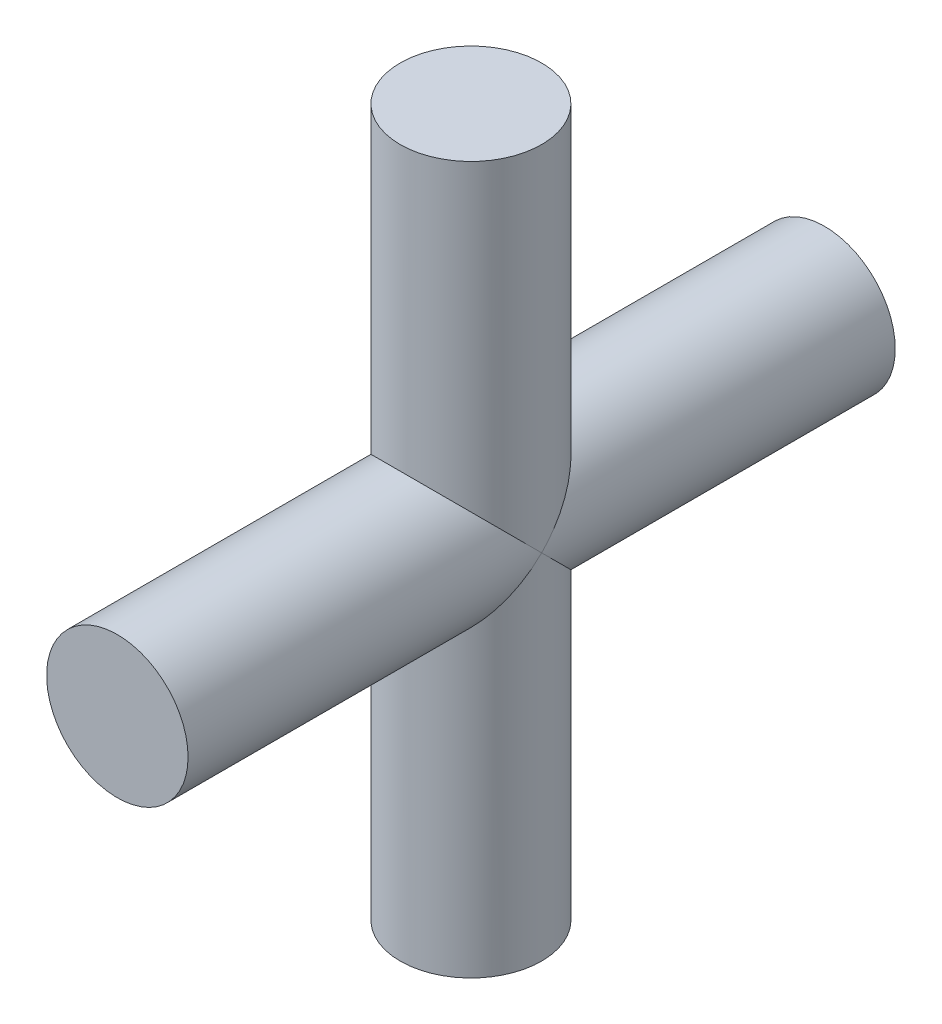
ISO-10303-21;
HEADER;
FILE_DESCRIPTION(('STEP AP214'),'2;1');
FILE_NAME('part.step','',(''),(''),'','','');
FILE_SCHEMA(('AUTOMOTIVE_DESIGN { 1 0 10303 214 1 1 1 1 }'));
ENDSEC;
DATA;
#1=APPLICATION_CONTEXT('core data for automotive mechanical design processes');
#2=APPLICATION_PROTOCOL_DEFINITION('international standard','automotive_design',2000,#1);
#3=PRODUCT_CONTEXT('',#1,'mechanical');
#4=PRODUCT('Part','Part','',(#3));
#5=PRODUCT_RELATED_PRODUCT_CATEGORY('part','',(#4));
#6=PRODUCT_DEFINITION_FORMATION('','',#4);
#7=PRODUCT_DEFINITION_CONTEXT('part definition',#1,'design');
#8=PRODUCT_DEFINITION('design','',#6,#7);
#9=PRODUCT_DEFINITION_SHAPE('','',#8);
#10=(LENGTH_UNIT() NAMED_UNIT(*) SI_UNIT(.MILLI.,.METRE.));
#11=(NAMED_UNIT(*) PLANE_ANGLE_UNIT() SI_UNIT($,.RADIAN.));
#12=(NAMED_UNIT(*) SI_UNIT($,.STERADIAN.) SOLID_ANGLE_UNIT());
#13=UNCERTAINTY_MEASURE_WITH_UNIT(LENGTH_MEASURE(1.E-05),#10,'distance_accuracy_value','');
#14=(GEOMETRIC_REPRESENTATION_CONTEXT(3) GLOBAL_UNCERTAINTY_ASSIGNED_CONTEXT((#13)) GLOBAL_UNIT_ASSIGNED_CONTEXT((#10,
#11,#12)) REPRESENTATION_CONTEXT('',''));
#15=CARTESIAN_POINT('',(0.,0.,0.));
#16=DIRECTION('',(0.,0.,1.));
#17=DIRECTION('',(1.,0.,0.));
#18=AXIS2_PLACEMENT_3D('',#15,#16,#17);
#19=CARTESIAN_POINT('',(0.,0.,50.));
#20=DIRECTION('',(0.,0.,-1.));
#21=DIRECTION('',(-1.,0.,0.));
#22=AXIS2_PLACEMENT_3D('',#19,#20,#21);
#23=CYLINDRICAL_SURFACE('',#22,5.);
#24=CARTESIAN_POINT('',(0.,0.,25.));
#25=DIRECTION('',(0.,-0.707106781186547,-0.707106781186547));
#26=DIRECTION('',(0.,0.707106781186547,-0.707106781186547));
#27=AXIS2_PLACEMENT_3D('',#24,#25,#26);
#28=ELLIPSE('',#27,7.07106781186548,5.);
#29=CARTESIAN_POINT('',(-5.,0.,25.));
#30=VERTEX_POINT('',#29);
#31=CARTESIAN_POINT('',(5.,0.,25.));
#32=VERTEX_POINT('',#31);
#33=EDGE_CURVE('E58',#30,#32,#28,.T.);
#34=ORIENTED_EDGE('',*,*,#33,.T.);
#35=CARTESIAN_POINT('',(0.,0.,25.));
#36=DIRECTION('',(0.,0.707106781186547,-0.707106781186547));
#37=DIRECTION('',(0.,-0.707106781186547,-0.707106781186547));
#38=AXIS2_PLACEMENT_3D('',#35,#36,#37);
#39=ELLIPSE('',#38,7.07106781186548,5.);
#40=EDGE_CURVE('E47',#32,#30,#39,.T.);
#41=ORIENTED_EDGE('',*,*,#40,.T.);
#42=EDGE_LOOP('',(#34,#41));
#43=FACE_BOUND('',#42,.T.);
#44=CARTESIAN_POINT('',(0.,0.,0.));
#45=DIRECTION('',(0.,0.,1.));
#46=DIRECTION('',(1.,0.,0.));
#47=AXIS2_PLACEMENT_3D('',#44,#45,#46);
#48=CIRCLE('',#47,5.);
#49=CARTESIAN_POINT('',(5.,0.,0.));
#50=VERTEX_POINT('',#49);
#51=EDGE_CURVE('E73',#50,#50,#48,.T.);
#52=ORIENTED_EDGE('',*,*,#51,.T.);
#53=EDGE_LOOP('',(#52));
#54=FACE_BOUND('',#53,.T.);
#55=ADVANCED_FACE('F39',(#43,#54),#23,.T.);
#56=CARTESIAN_POINT('',(0.,0.,0.));
#57=DIRECTION('',(0.,0.,1.));
#58=DIRECTION('',(1.,0.,0.));
#59=AXIS2_PLACEMENT_3D('',#56,#57,#58);
#60=PLANE('',#59);
#61=ORIENTED_EDGE('',*,*,#51,.F.);
#62=EDGE_LOOP('',(#61));
#63=FACE_BOUND('',#62,.T.);
#64=ADVANCED_FACE('F104',(#63),#60,.F.);
#65=CARTESIAN_POINT('',(0.,-25.,25.));
#66=DIRECTION('',(0.,1.,0.));
#67=DIRECTION('',(0.,0.,1.));
#68=AXIS2_PLACEMENT_3D('',#65,#66,#67);
#69=PLANE('',#68);
#70=CARTESIAN_POINT('',(0.,-25.,25.));
#71=DIRECTION('',(0.,1.,0.));
#72=DIRECTION('',(0.,0.,1.));
#73=AXIS2_PLACEMENT_3D('',#70,#71,#72);
#74=CIRCLE('',#73,5.);
#75=CARTESIAN_POINT('',(0.,-25.,30.));
#76=VERTEX_POINT('',#75);
#77=EDGE_CURVE('E77',#76,#76,#74,.T.);
#78=ORIENTED_EDGE('',*,*,#77,.F.);
#79=EDGE_LOOP('',(#78));
#80=FACE_BOUND('',#79,.T.);
#81=ADVANCED_FACE('F99',(#80),#69,.F.);
#82=CARTESIAN_POINT('',(0.,-25.,25.));
#83=DIRECTION('',(0.,1.,0.));
#84=DIRECTION('',(0.,0.,1.));
#85=AXIS2_PLACEMENT_3D('',#82,#83,#84);
#86=CYLINDRICAL_SURFACE('',#85,5.);
#87=ORIENTED_EDGE('',*,*,#77,.T.);
#88=EDGE_LOOP('',(#87));
#89=FACE_BOUND('',#88,.T.);
#90=ORIENTED_EDGE('',*,*,#40,.F.);
#91=CARTESIAN_POINT('',(0.,0.,25.));
#92=DIRECTION('',(0.,-0.707106781186547,-0.707106781186547));
#93=DIRECTION('',(0.,0.707106781186547,-0.707106781186547));
#94=AXIS2_PLACEMENT_3D('',#91,#92,#93);
#95=ELLIPSE('',#94,7.07106781186548,5.);
#96=EDGE_CURVE('E52',#30,#32,#95,.F.);
#97=ORIENTED_EDGE('',*,*,#96,.F.);
#98=EDGE_LOOP('',(#90,#97));
#99=FACE_BOUND('',#98,.T.);
#100=ADVANCED_FACE('F65',(#89,#99),#86,.T.);
#101=CARTESIAN_POINT('',(0.,25.,25.));
#102=DIRECTION('',(0.,1.,0.));
#103=DIRECTION('',(0.,0.,1.));
#104=AXIS2_PLACEMENT_3D('',#101,#102,#103);
#105=CIRCLE('',#104,5.);
#106=CARTESIAN_POINT('',(0.,25.,30.));
#107=VERTEX_POINT('',#106);
#108=EDGE_CURVE('E84',#107,#107,#105,.T.);
#109=ORIENTED_EDGE('',*,*,#108,.F.);
#110=EDGE_LOOP('',(#109));
#111=FACE_BOUND('',#110,.T.);
#112=CARTESIAN_POINT('',(0.,0.,25.));
#113=DIRECTION('',(0.,0.707106781186547,-0.707106781186547));
#114=DIRECTION('',(0.,-0.707106781186547,-0.707106781186547));
#115=AXIS2_PLACEMENT_3D('',#112,#113,#114);
#116=ELLIPSE('',#115,7.07106781186548,5.);
#117=EDGE_CURVE('E11',#32,#30,#116,.F.);
#118=ORIENTED_EDGE('',*,*,#117,.F.);
#119=ORIENTED_EDGE('',*,*,#33,.F.);
#120=EDGE_LOOP('',(#118,#119));
#121=FACE_BOUND('',#120,.T.);
#122=ADVANCED_FACE('F59',(#111,#121),#86,.T.);
#123=CARTESIAN_POINT('',(0.,25.,25.));
#124=DIRECTION('',(0.,1.,0.));
#125=DIRECTION('',(0.,0.,1.));
#126=AXIS2_PLACEMENT_3D('',#123,#124,#125);
#127=PLANE('',#126);
#128=ORIENTED_EDGE('',*,*,#108,.T.);
#129=EDGE_LOOP('',(#128));
#130=FACE_BOUND('',#129,.T.);
#131=ADVANCED_FACE('F89',(#130),#127,.T.);
#132=CARTESIAN_POINT('',(0.,0.,50.));
#133=DIRECTION('',(0.,0.,1.));
#134=DIRECTION('',(1.,0.,0.));
#135=AXIS2_PLACEMENT_3D('',#132,#133,#134);
#136=PLANE('',#135);
#137=CARTESIAN_POINT('',(0.,0.,50.));
#138=DIRECTION('',(0.,0.,1.));
#139=DIRECTION('',(1.,0.,0.));
#140=AXIS2_PLACEMENT_3D('',#137,#138,#139);
#141=CIRCLE('',#140,5.);
#142=CARTESIAN_POINT('',(5.,0.,50.));
#143=VERTEX_POINT('',#142);
#144=EDGE_CURVE('E67',#143,#143,#141,.T.);
#145=ORIENTED_EDGE('',*,*,#144,.T.);
#146=EDGE_LOOP('',(#145));
#147=FACE_BOUND('',#146,.T.);
#148=ADVANCED_FACE('F97',(#147),#136,.T.);
#149=ORIENTED_EDGE('',*,*,#144,.F.);
#150=EDGE_LOOP('',(#149));
#151=FACE_BOUND('',#150,.T.);
#152=ORIENTED_EDGE('',*,*,#96,.T.);
#153=ORIENTED_EDGE('',*,*,#117,.T.);
#154=EDGE_LOOP('',(#152,#153));
#155=FACE_BOUND('',#154,.T.);
#156=ADVANCED_FACE('F69',(#151,#155),#23,.T.);
#157=CLOSED_SHELL('',(#55,#64,#81,#100,#122,#131,#148,#156));
#158=MANIFOLD_SOLID_BREP('B2',#157);
#159=ADVANCED_BREP_SHAPE_REPRESENTATION('',(#18,#158),#14);
#160=SHAPE_DEFINITION_REPRESENTATION(#9,#159);
ENDSEC;
END-ISO-10303-21;
